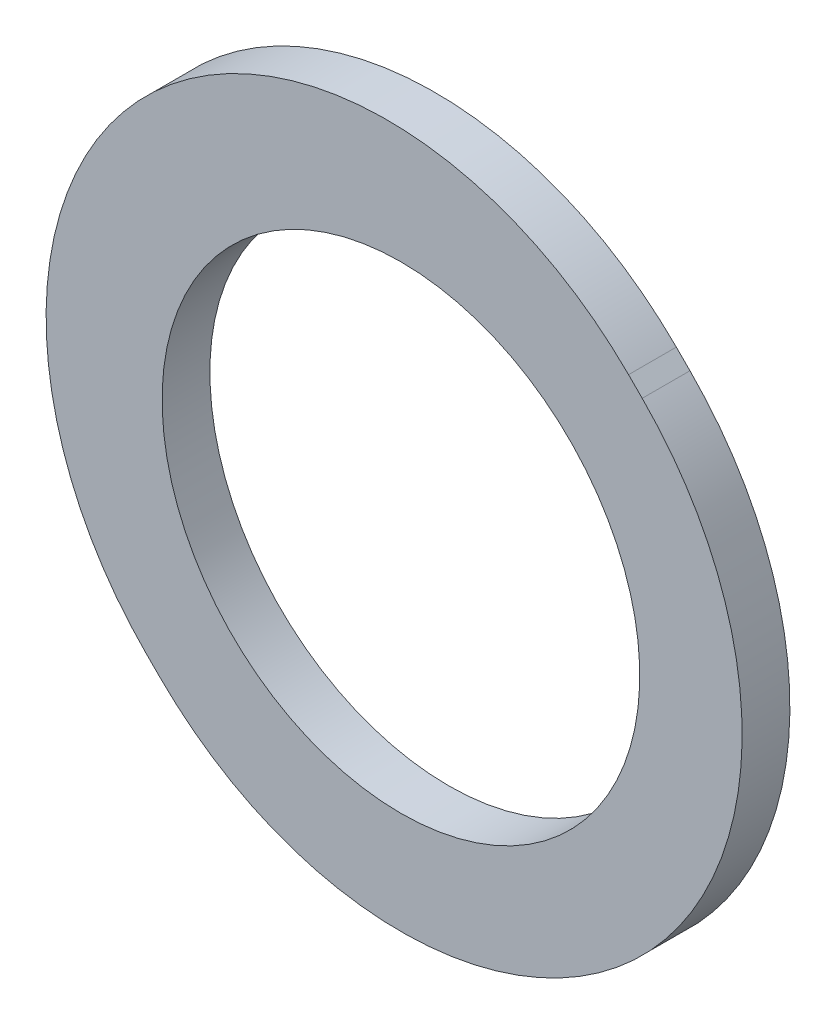
ISO-10303-21;
HEADER;
FILE_DESCRIPTION(('STEP AP214'),'2;1');
FILE_NAME('part.step','',(''),(''),'','','');
FILE_SCHEMA(('AUTOMOTIVE_DESIGN { 1 0 10303 214 1 1 1 1 }'));
ENDSEC;
DATA;
#1=APPLICATION_CONTEXT('core data for automotive mechanical design processes');
#2=APPLICATION_PROTOCOL_DEFINITION('international standard','automotive_design',2000,#1);
#3=PRODUCT_CONTEXT('',#1,'mechanical');
#4=PRODUCT('Part','Part','',(#3));
#5=PRODUCT_RELATED_PRODUCT_CATEGORY('part','',(#4));
#6=PRODUCT_DEFINITION_FORMATION('','',#4);
#7=PRODUCT_DEFINITION_CONTEXT('part definition',#1,'design');
#8=PRODUCT_DEFINITION('design','',#6,#7);
#9=PRODUCT_DEFINITION_SHAPE('','',#8);
#10=(LENGTH_UNIT() NAMED_UNIT(*) SI_UNIT(.MILLI.,.METRE.));
#11=(NAMED_UNIT(*) PLANE_ANGLE_UNIT() SI_UNIT($,.RADIAN.));
#12=(NAMED_UNIT(*) SI_UNIT($,.STERADIAN.) SOLID_ANGLE_UNIT());
#13=UNCERTAINTY_MEASURE_WITH_UNIT(LENGTH_MEASURE(1.E-05),#10,'distance_accuracy_value','');
#14=(GEOMETRIC_REPRESENTATION_CONTEXT(3) GLOBAL_UNCERTAINTY_ASSIGNED_CONTEXT((#13)) GLOBAL_UNIT_ASSIGNED_CONTEXT((#10,
#11,#12)) REPRESENTATION_CONTEXT('',''));
#15=CARTESIAN_POINT('',(0.,0.,0.));
#16=DIRECTION('',(0.,0.,1.));
#17=DIRECTION('',(1.,0.,0.));
#18=AXIS2_PLACEMENT_3D('',#15,#16,#17);
#19=CARTESIAN_POINT('',(99.15,-81.87,-0.045));
#20=DIRECTION('',(0.,0.,-1.));
#21=DIRECTION('',(0.,-1.,0.));
#22=AXIS2_PLACEMENT_3D('',#19,#20,#21);
#23=CYLINDRICAL_SURFACE('',#22,0.175);
#24=CARTESIAN_POINT('',(99.15,-81.87,-0.035));
#25=DIRECTION('',(0.,0.,-1.));
#26=DIRECTION('',(0.,-1.,0.));
#27=AXIS2_PLACEMENT_3D('',#24,#25,#26);
#28=CIRCLE('',#27,0.175);
#29=CARTESIAN_POINT('',(99.15,-82.045,-0.035));
#30=VERTEX_POINT('',#29);
#31=EDGE_CURVE('E121',#30,#30,#28,.T.);
#32=ORIENTED_EDGE('',*,*,#31,.T.);
#33=DIRECTION('',(0.,0.,1.));
#34=VECTOR('',#33,1.);
#35=CARTESIAN_POINT('',(99.15,-82.045,-0.045));
#36=LINE('',#35,#34);
#37=CARTESIAN_POINT('',(99.15,-82.045,0.));
#38=VERTEX_POINT('',#37);
#39=EDGE_CURVE('E11',#30,#38,#36,.T.);
#40=ORIENTED_EDGE('',*,*,#39,.T.);
#41=CARTESIAN_POINT('',(99.15,-81.87,0.));
#42=DIRECTION('',(0.,0.,-1.));
#43=DIRECTION('',(0.,-1.,0.));
#44=AXIS2_PLACEMENT_3D('',#41,#42,#43);
#45=CIRCLE('',#44,0.175);
#46=EDGE_CURVE('E26',#38,#38,#45,.T.);
#47=ORIENTED_EDGE('',*,*,#46,.F.);
#48=ORIENTED_EDGE('',*,*,#39,.F.);
#49=EDGE_LOOP('',(#32,#40,#47,#48));
#50=FACE_BOUND('',#49,.T.);
#51=ADVANCED_FACE('F17',(#50),#23,.F.);
#52=CARTESIAN_POINT('',(99.326776,-81.693223,-0.035));
#53=DIRECTION('',(-0.707106781187048,-0.707106781186048,0.));
#54=DIRECTION('',(-0.707106781186048,0.707106781187048,0.));
#55=AXIS2_PLACEMENT_3D('',#52,#53,#54);
#56=PLANE('',#55);
#57=DIRECTION('',(-0.707106781186048,0.707106781187048,0.));
#58=VECTOR('',#57,1.);
#59=CARTESIAN_POINT('',(99.326776,-81.693223,-0.035));
#60=LINE('',#59,#58);
#61=CARTESIAN_POINT('',(99.326776,-81.693223,-0.035));
#62=VERTEX_POINT('',#61);
#63=CARTESIAN_POINT('',(99.316776,-81.683223,-0.035));
#64=VERTEX_POINT('',#63);
#65=EDGE_CURVE('E89',#62,#64,#60,.T.);
#66=ORIENTED_EDGE('',*,*,#65,.T.);
#67=DIRECTION('',(0.,0.,1.));
#68=VECTOR('',#67,1.);
#69=CARTESIAN_POINT('',(99.316776,-81.683223,-0.035));
#70=LINE('',#69,#68);
#71=CARTESIAN_POINT('',(99.316776,-81.683223,0.));
#72=VERTEX_POINT('',#71);
#73=EDGE_CURVE('E123',#64,#72,#70,.T.);
#74=ORIENTED_EDGE('',*,*,#73,.T.);
#75=DIRECTION('',(-0.707106781186048,0.707106781187048,0.));
#76=VECTOR('',#75,1.);
#77=CARTESIAN_POINT('',(99.326776,-81.693223,0.));
#78=LINE('',#77,#76);
#79=CARTESIAN_POINT('',(99.326776,-81.693223,0.));
#80=VERTEX_POINT('',#79);
#81=EDGE_CURVE('E20',#80,#72,#78,.T.);
#82=ORIENTED_EDGE('',*,*,#81,.F.);
#83=DIRECTION('',(0.,0.,1.));
#84=VECTOR('',#83,1.);
#85=CARTESIAN_POINT('',(99.326776,-81.693223,-0.035));
#86=LINE('',#85,#84);
#87=EDGE_CURVE('E86',#62,#80,#86,.T.);
#88=ORIENTED_EDGE('',*,*,#87,.F.);
#89=EDGE_LOOP('',(#66,#74,#82,#88));
#90=FACE_BOUND('',#89,.T.);
#91=ADVANCED_FACE('F144',(#90),#56,.F.);
#92=CARTESIAN_POINT('',(98.963223,-82.036776,0.));
#93=DIRECTION('',(0.,0.,1.));
#94=DIRECTION('',(1.,0.,0.));
#95=AXIS2_PLACEMENT_3D('',#92,#93,#94);
#96=PLANE('',#95);
#97=ORIENTED_EDGE('',*,*,#46,.T.);
#98=EDGE_LOOP('',(#97));
#99=FACE_BOUND('',#98,.T.);
#100=DIRECTION('',(0.707106781187048,-0.707106781186048,0.));
#101=VECTOR('',#100,1.);
#102=CARTESIAN_POINT('',(98.963223,-82.036776,0.));
#103=LINE('',#102,#101);
#104=CARTESIAN_POINT('',(98.963223,-82.036776,0.));
#105=VERTEX_POINT('',#104);
#106=CARTESIAN_POINT('',(98.973223,-82.046776,0.));
#107=VERTEX_POINT('',#106);
#108=EDGE_CURVE('E92',#105,#107,#103,.T.);
#109=ORIENTED_EDGE('',*,*,#108,.T.);
#110=CARTESIAN_POINT('',(99.1499995,-81.8699995,0.));
#111=DIRECTION('',(0.,0.,1.));
#112=DIRECTION('',(-0.707106781186548,-0.707106781186548,0.));
#113=AXIS2_PLACEMENT_3D('',#110,#111,#112);
#114=CIRCLE('',#113,0.249999723809);
#115=EDGE_CURVE('E78',#107,#80,#114,.T.);
#116=ORIENTED_EDGE('',*,*,#115,.T.);
#117=ORIENTED_EDGE('',*,*,#81,.T.);
#118=CARTESIAN_POINT('',(99.1399995,-81.8599995,0.));
#119=DIRECTION('',(0.,0.,1.));
#120=DIRECTION('',(0.707106781186548,0.707106781186548,0.));
#121=AXIS2_PLACEMENT_3D('',#118,#119,#120);
#122=CIRCLE('',#121,0.249999723809);
#123=EDGE_CURVE('E95',#72,#105,#122,.T.);
#124=ORIENTED_EDGE('',*,*,#123,.T.);
#125=EDGE_LOOP('',(#109,#116,#117,#124));
#126=FACE_BOUND('',#125,.T.);
#127=ADVANCED_FACE('F93',(#99,#126),#96,.T.);
#128=CARTESIAN_POINT('',(98.963223,-82.036776,-0.035));
#129=DIRECTION('',(0.,0.,1.));
#130=DIRECTION('',(1.,0.,0.));
#131=AXIS2_PLACEMENT_3D('',#128,#129,#130);
#132=PLANE('',#131);
#133=ORIENTED_EDGE('',*,*,#31,.F.);
#134=EDGE_LOOP('',(#133));
#135=FACE_BOUND('',#134,.T.);
#136=CARTESIAN_POINT('',(99.1399995,-81.8599995,-0.035));
#137=DIRECTION('',(0.,0.,1.));
#138=DIRECTION('',(0.707106781186548,0.707106781186548,0.));
#139=AXIS2_PLACEMENT_3D('',#136,#137,#138);
#140=CIRCLE('',#139,0.249999723809);
#141=CARTESIAN_POINT('',(98.963223,-82.036776,-0.035));
#142=VERTEX_POINT('',#141);
#143=EDGE_CURVE('E116',#64,#142,#140,.T.);
#144=ORIENTED_EDGE('',*,*,#143,.F.);
#145=ORIENTED_EDGE('',*,*,#65,.F.);
#146=CARTESIAN_POINT('',(99.1499995,-81.8699995,-0.035));
#147=DIRECTION('',(0.,0.,1.));
#148=DIRECTION('',(-0.707106781186548,-0.707106781186548,0.));
#149=AXIS2_PLACEMENT_3D('',#146,#147,#148);
#150=CIRCLE('',#149,0.249999723809);
#151=CARTESIAN_POINT('',(98.973223,-82.046776,-0.035));
#152=VERTEX_POINT('',#151);
#153=EDGE_CURVE('E128',#152,#62,#150,.T.);
#154=ORIENTED_EDGE('',*,*,#153,.F.);
#155=DIRECTION('',(0.707106781187048,-0.707106781186048,0.));
#156=VECTOR('',#155,1.);
#157=CARTESIAN_POINT('',(98.963223,-82.036776,-0.035));
#158=LINE('',#157,#156);
#159=EDGE_CURVE('E104',#142,#152,#158,.T.);
#160=ORIENTED_EDGE('',*,*,#159,.F.);
#161=EDGE_LOOP('',(#144,#145,#154,#160));
#162=FACE_BOUND('',#161,.T.);
#163=ADVANCED_FACE('F155',(#135,#162),#132,.F.);
#164=CARTESIAN_POINT('',(99.1499995,-81.8699995,-0.035));
#165=DIRECTION('',(0.,0.,-1.));
#166=DIRECTION('',(-0.707106781186548,-0.707106781186548,0.));
#167=AXIS2_PLACEMENT_3D('',#164,#165,#166);
#168=CYLINDRICAL_SURFACE('',#167,0.249999723809);
#169=ORIENTED_EDGE('',*,*,#153,.T.);
#170=ORIENTED_EDGE('',*,*,#87,.T.);
#171=ORIENTED_EDGE('',*,*,#115,.F.);
#172=DIRECTION('',(0.,0.,1.));
#173=VECTOR('',#172,1.);
#174=CARTESIAN_POINT('',(98.973223,-82.046776,-0.035));
#175=LINE('',#174,#173);
#176=EDGE_CURVE('E83',#152,#107,#175,.T.);
#177=ORIENTED_EDGE('',*,*,#176,.F.);
#178=EDGE_LOOP('',(#169,#170,#171,#177));
#179=FACE_BOUND('',#178,.T.);
#180=ADVANCED_FACE('F81',(#179),#168,.T.);
#181=CARTESIAN_POINT('',(99.1399995,-81.8599995,-0.035));
#182=DIRECTION('',(0.,0.,-1.));
#183=DIRECTION('',(0.707106781186548,0.707106781186548,0.));
#184=AXIS2_PLACEMENT_3D('',#181,#182,#183);
#185=CYLINDRICAL_SURFACE('',#184,0.249999723809);
#186=ORIENTED_EDGE('',*,*,#143,.T.);
#187=DIRECTION('',(0.,0.,1.));
#188=VECTOR('',#187,1.);
#189=CARTESIAN_POINT('',(98.963223,-82.036776,-0.035));
#190=LINE('',#189,#188);
#191=EDGE_CURVE('E100',#142,#105,#190,.T.);
#192=ORIENTED_EDGE('',*,*,#191,.T.);
#193=ORIENTED_EDGE('',*,*,#123,.F.);
#194=ORIENTED_EDGE('',*,*,#73,.F.);
#195=EDGE_LOOP('',(#186,#192,#193,#194));
#196=FACE_BOUND('',#195,.T.);
#197=ADVANCED_FACE('F161',(#196),#185,.T.);
#198=CARTESIAN_POINT('',(98.963223,-82.036776,-0.035));
#199=DIRECTION('',(0.707106781186048,0.707106781187048,0.));
#200=DIRECTION('',(0.,0.,-1.));
#201=AXIS2_PLACEMENT_3D('',#198,#199,#200);
#202=PLANE('',#201);
#203=ORIENTED_EDGE('',*,*,#159,.T.);
#204=ORIENTED_EDGE('',*,*,#176,.T.);
#205=ORIENTED_EDGE('',*,*,#108,.F.);
#206=ORIENTED_EDGE('',*,*,#191,.F.);
#207=EDGE_LOOP('',(#203,#204,#205,#206));
#208=FACE_BOUND('',#207,.T.);
#209=ADVANCED_FACE('F102',(#208),#202,.F.);
#210=CLOSED_SHELL('',(#51,#91,#127,#163,#180,#197,#209));
#211=MANIFOLD_SOLID_BREP('B1',#210);
#212=ADVANCED_BREP_SHAPE_REPRESENTATION('',(#18,#211),#14);
#213=SHAPE_DEFINITION_REPRESENTATION(#9,#212);
ENDSEC;
END-ISO-10303-21;
